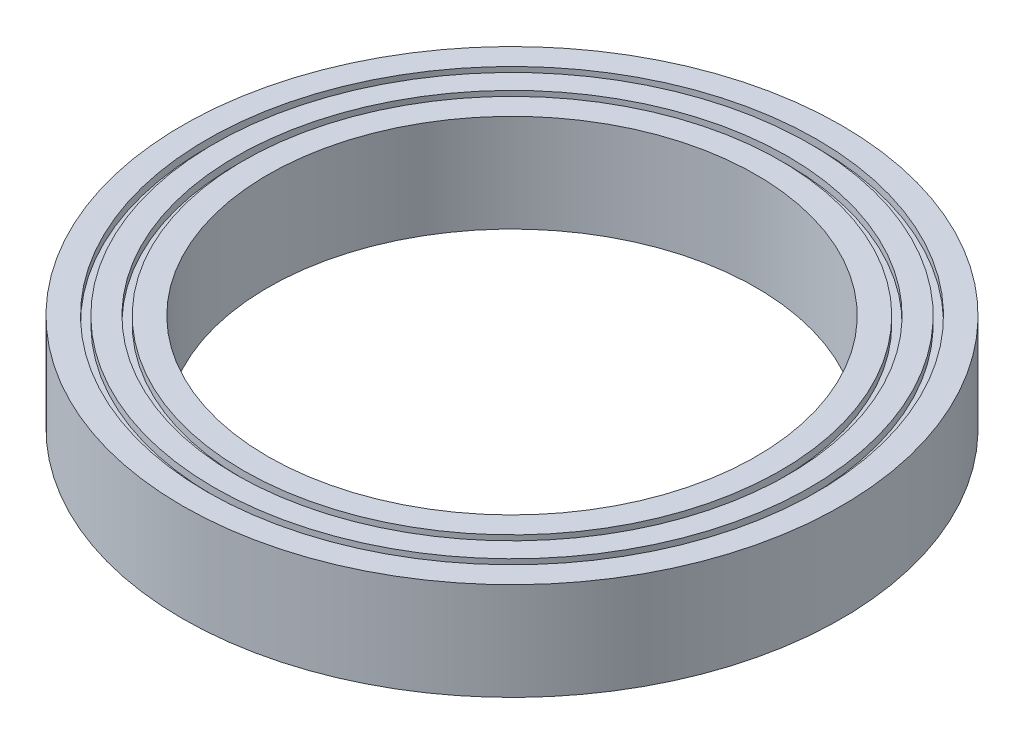
ISO-10303-21;
HEADER;
FILE_DESCRIPTION(('STEP AP214'),'2;1');
FILE_NAME('part.step','',(''),(''),'','','');
FILE_SCHEMA(('AUTOMOTIVE_DESIGN { 1 0 10303 214 1 1 1 1 }'));
ENDSEC;
DATA;
#1=APPLICATION_CONTEXT('core data for automotive mechanical design processes');
#2=APPLICATION_PROTOCOL_DEFINITION('international standard','automotive_design',2000,#1);
#3=PRODUCT_CONTEXT('',#1,'mechanical');
#4=PRODUCT('Part','Part','',(#3));
#5=PRODUCT_RELATED_PRODUCT_CATEGORY('part','',(#4));
#6=PRODUCT_DEFINITION_FORMATION('','',#4);
#7=PRODUCT_DEFINITION_CONTEXT('part definition',#1,'design');
#8=PRODUCT_DEFINITION('design','',#6,#7);
#9=PRODUCT_DEFINITION_SHAPE('','',#8);
#10=(LENGTH_UNIT() NAMED_UNIT(*) SI_UNIT(.MILLI.,.METRE.));
#11=(NAMED_UNIT(*) PLANE_ANGLE_UNIT() SI_UNIT($,.RADIAN.));
#12=(NAMED_UNIT(*) SI_UNIT($,.STERADIAN.) SOLID_ANGLE_UNIT());
#13=UNCERTAINTY_MEASURE_WITH_UNIT(LENGTH_MEASURE(1.E-05),#10,'distance_accuracy_value','');
#14=(GEOMETRIC_REPRESENTATION_CONTEXT(3) GLOBAL_UNCERTAINTY_ASSIGNED_CONTEXT((#13)) GLOBAL_UNIT_ASSIGNED_CONTEXT((#10,
#11,#12)) REPRESENTATION_CONTEXT('',''));
#15=CARTESIAN_POINT('',(0.,0.,0.));
#16=DIRECTION('',(0.,0.,1.));
#17=DIRECTION('',(1.,0.,0.));
#18=AXIS2_PLACEMENT_3D('',#15,#16,#17);
#19=CARTESIAN_POINT('',(0.,0.,0.));
#20=DIRECTION('',(0.,1.,0.));
#21=DIRECTION('',(0.,0.,1.));
#22=AXIS2_PLACEMENT_3D('',#19,#20,#21);
#23=PLANE('',#22);
#24=CARTESIAN_POINT('',(0.,0.,0.));
#25=DIRECTION('',(0.,1.,0.));
#26=DIRECTION('',(0.,0.,1.));
#27=AXIS2_PLACEMENT_3D('',#24,#25,#26);
#28=CIRCLE('',#27,10.);
#29=CARTESIAN_POINT('',(0.,0.,10.));
#30=VERTEX_POINT('',#29);
#31=EDGE_CURVE('E64',#30,#30,#28,.T.);
#32=ORIENTED_EDGE('',*,*,#31,.T.);
#33=EDGE_LOOP('',(#32));
#34=FACE_BOUND('',#33,.T.);
#35=CARTESIAN_POINT('',(0.,0.,0.));
#36=DIRECTION('',(0.,1.,0.));
#37=DIRECTION('',(0.,0.,1.));
#38=AXIS2_PLACEMENT_3D('',#35,#36,#37);
#39=CIRCLE('',#38,11.);
#40=CARTESIAN_POINT('',(0.,0.,11.));
#41=VERTEX_POINT('',#40);
#42=EDGE_CURVE('E109',#41,#41,#39,.T.);
#43=ORIENTED_EDGE('',*,*,#42,.F.);
#44=EDGE_LOOP('',(#43));
#45=FACE_BOUND('',#44,.T.);
#46=ADVANCED_FACE('F51',(#34,#45),#23,.F.);
#47=CARTESIAN_POINT('',(0.,0.,0.));
#48=DIRECTION('',(0.,1.,0.));
#49=DIRECTION('',(0.,0.,1.));
#50=AXIS2_PLACEMENT_3D('',#47,#48,#49);
#51=CIRCLE('',#50,11.3);
#52=CARTESIAN_POINT('',(0.,0.,11.3));
#53=VERTEX_POINT('',#52);
#54=EDGE_CURVE('E106',#53,#53,#51,.T.);
#55=ORIENTED_EDGE('',*,*,#54,.T.);
#56=EDGE_LOOP('',(#55));
#57=FACE_BOUND('',#56,.T.);
#58=CARTESIAN_POINT('',(0.,0.,0.));
#59=DIRECTION('',(0.,1.,0.));
#60=DIRECTION('',(0.,0.,1.));
#61=AXIS2_PLACEMENT_3D('',#58,#59,#60);
#62=CIRCLE('',#61,12.2);
#63=CARTESIAN_POINT('',(0.,0.,12.2));
#64=VERTEX_POINT('',#63);
#65=EDGE_CURVE('E98',#64,#64,#62,.T.);
#66=ORIENTED_EDGE('',*,*,#65,.F.);
#67=EDGE_LOOP('',(#66));
#68=FACE_BOUND('',#67,.T.);
#69=ADVANCED_FACE('F128',(#57,#68),#23,.F.);
#70=CARTESIAN_POINT('',(0.,4.,0.));
#71=DIRECTION('',(0.,1.,0.));
#72=DIRECTION('',(0.,0.,1.));
#73=AXIS2_PLACEMENT_3D('',#70,#71,#72);
#74=PLANE('',#73);
#75=CARTESIAN_POINT('',(0.,4.,0.));
#76=DIRECTION('',(0.,1.,0.));
#77=DIRECTION('',(0.,0.,1.));
#78=AXIS2_PLACEMENT_3D('',#75,#76,#77);
#79=CIRCLE('',#78,10.);
#80=CARTESIAN_POINT('',(0.,4.,10.));
#81=VERTEX_POINT('',#80);
#82=EDGE_CURVE('E65',#81,#81,#79,.T.);
#83=ORIENTED_EDGE('',*,*,#82,.F.);
#84=EDGE_LOOP('',(#83));
#85=FACE_BOUND('',#84,.T.);
#86=CARTESIAN_POINT('',(0.,4.,0.));
#87=DIRECTION('',(0.,1.,0.));
#88=DIRECTION('',(0.,0.,1.));
#89=AXIS2_PLACEMENT_3D('',#86,#87,#88);
#90=CIRCLE('',#89,11.);
#91=CARTESIAN_POINT('',(0.,4.,11.));
#92=VERTEX_POINT('',#91);
#93=EDGE_CURVE('E88',#92,#92,#90,.T.);
#94=ORIENTED_EDGE('',*,*,#93,.T.);
#95=EDGE_LOOP('',(#94));
#96=FACE_BOUND('',#95,.T.);
#97=ADVANCED_FACE('F140',(#85,#96),#74,.T.);
#98=CARTESIAN_POINT('',(0.,4.,0.));
#99=DIRECTION('',(0.,1.,0.));
#100=DIRECTION('',(0.,0.,1.));
#101=AXIS2_PLACEMENT_3D('',#98,#99,#100);
#102=CIRCLE('',#101,11.3);
#103=CARTESIAN_POINT('',(0.,4.,11.3));
#104=VERTEX_POINT('',#103);
#105=EDGE_CURVE('E81',#104,#104,#102,.T.);
#106=ORIENTED_EDGE('',*,*,#105,.F.);
#107=EDGE_LOOP('',(#106));
#108=FACE_BOUND('',#107,.T.);
#109=CARTESIAN_POINT('',(0.,4.,0.));
#110=DIRECTION('',(0.,1.,0.));
#111=DIRECTION('',(0.,0.,1.));
#112=AXIS2_PLACEMENT_3D('',#109,#110,#111);
#113=CIRCLE('',#112,12.2);
#114=CARTESIAN_POINT('',(0.,4.,12.2));
#115=VERTEX_POINT('',#114);
#116=EDGE_CURVE('E74',#115,#115,#113,.T.);
#117=ORIENTED_EDGE('',*,*,#116,.T.);
#118=EDGE_LOOP('',(#117));
#119=FACE_BOUND('',#118,.T.);
#120=ADVANCED_FACE('F147',(#108,#119),#74,.T.);
#121=CARTESIAN_POINT('',(0.,4.,0.));
#122=DIRECTION('',(0.,1.,0.));
#123=DIRECTION('',(0.,0.,1.));
#124=AXIS2_PLACEMENT_3D('',#121,#122,#123);
#125=CIRCLE('',#124,12.5);
#126=CARTESIAN_POINT('',(0.,4.,12.5));
#127=VERTEX_POINT('',#126);
#128=EDGE_CURVE('E68',#127,#127,#125,.T.);
#129=ORIENTED_EDGE('',*,*,#128,.F.);
#130=EDGE_LOOP('',(#129));
#131=FACE_BOUND('',#130,.T.);
#132=CARTESIAN_POINT('',(0.,4.,0.));
#133=DIRECTION('',(0.,1.,0.));
#134=DIRECTION('',(0.,0.,1.));
#135=AXIS2_PLACEMENT_3D('',#132,#133,#134);
#136=CIRCLE('',#135,13.5);
#137=CARTESIAN_POINT('',(0.,4.,13.5));
#138=VERTEX_POINT('',#137);
#139=EDGE_CURVE('E11',#138,#138,#136,.T.);
#140=ORIENTED_EDGE('',*,*,#139,.T.);
#141=EDGE_LOOP('',(#140));
#142=FACE_BOUND('',#141,.T.);
#143=ADVANCED_FACE('F142',(#131,#142),#74,.T.);
#144=CARTESIAN_POINT('',(0.,0.,0.));
#145=DIRECTION('',(0.,1.,0.));
#146=DIRECTION('',(0.,0.,1.));
#147=AXIS2_PLACEMENT_3D('',#144,#145,#146);
#148=CIRCLE('',#147,12.5);
#149=CARTESIAN_POINT('',(0.,0.,12.5));
#150=VERTEX_POINT('',#149);
#151=EDGE_CURVE('E94',#150,#150,#148,.T.);
#152=ORIENTED_EDGE('',*,*,#151,.T.);
#153=EDGE_LOOP('',(#152));
#154=FACE_BOUND('',#153,.T.);
#155=CARTESIAN_POINT('',(0.,0.,0.));
#156=DIRECTION('',(0.,1.,0.));
#157=DIRECTION('',(0.,0.,1.));
#158=AXIS2_PLACEMENT_3D('',#155,#156,#157);
#159=CIRCLE('',#158,13.5);
#160=CARTESIAN_POINT('',(0.,0.,13.5));
#161=VERTEX_POINT('',#160);
#162=EDGE_CURVE('E54',#161,#161,#159,.T.);
#163=ORIENTED_EDGE('',*,*,#162,.F.);
#164=EDGE_LOOP('',(#163));
#165=FACE_BOUND('',#164,.T.);
#166=ADVANCED_FACE('F135',(#154,#165),#23,.F.);
#167=CARTESIAN_POINT('',(0.,4.,0.));
#168=DIRECTION('',(0.,-1.,0.));
#169=DIRECTION('',(0.,0.,-1.));
#170=AXIS2_PLACEMENT_3D('',#167,#168,#169);
#171=CYLINDRICAL_SURFACE('',#170,13.5);
#172=ORIENTED_EDGE('',*,*,#139,.F.);
#173=EDGE_LOOP('',(#172));
#174=FACE_BOUND('',#173,.T.);
#175=ORIENTED_EDGE('',*,*,#162,.T.);
#176=EDGE_LOOP('',(#175));
#177=FACE_BOUND('',#176,.T.);
#178=ADVANCED_FACE('F52',(#174,#177),#171,.T.);
#179=CARTESIAN_POINT('',(0.,4.,0.));
#180=DIRECTION('',(0.,-1.,0.));
#181=DIRECTION('',(0.,0.,-1.));
#182=AXIS2_PLACEMENT_3D('',#179,#180,#181);
#183=CYLINDRICAL_SURFACE('',#182,10.);
#184=ORIENTED_EDGE('',*,*,#82,.T.);
#185=EDGE_LOOP('',(#184));
#186=FACE_BOUND('',#185,.T.);
#187=ORIENTED_EDGE('',*,*,#31,.F.);
#188=EDGE_LOOP('',(#187));
#189=FACE_BOUND('',#188,.T.);
#190=ADVANCED_FACE('F150',(#186,#189),#183,.F.);
#191=CARTESIAN_POINT('',(0.,3.7,0.));
#192=DIRECTION('',(0.,1.,0.));
#193=DIRECTION('',(0.,0.,1.));
#194=AXIS2_PLACEMENT_3D('',#191,#192,#193);
#195=CYLINDRICAL_SURFACE('',#194,12.2);
#196=CARTESIAN_POINT('',(0.,3.7,0.));
#197=DIRECTION('',(0.,1.,0.));
#198=DIRECTION('',(0.,0.,1.));
#199=AXIS2_PLACEMENT_3D('',#196,#197,#198);
#200=CIRCLE('',#199,12.2);
#201=CARTESIAN_POINT('',(0.,3.7,12.2));
#202=VERTEX_POINT('',#201);
#203=EDGE_CURVE('E71',#202,#202,#200,.T.);
#204=ORIENTED_EDGE('',*,*,#203,.T.);
#205=EDGE_LOOP('',(#204));
#206=FACE_BOUND('',#205,.T.);
#207=ORIENTED_EDGE('',*,*,#116,.F.);
#208=EDGE_LOOP('',(#207));
#209=FACE_BOUND('',#208,.T.);
#210=ADVANCED_FACE('F187',(#206,#209),#195,.T.);
#211=CARTESIAN_POINT('',(0.,3.7,0.));
#212=DIRECTION('',(0.,1.,0.));
#213=DIRECTION('',(0.,0.,1.));
#214=AXIS2_PLACEMENT_3D('',#211,#212,#213);
#215=CYLINDRICAL_SURFACE('',#214,12.5);
#216=CARTESIAN_POINT('',(0.,3.7,0.));
#217=DIRECTION('',(0.,1.,0.));
#218=DIRECTION('',(0.,0.,1.));
#219=AXIS2_PLACEMENT_3D('',#216,#217,#218);
#220=CIRCLE('',#219,12.5);
#221=CARTESIAN_POINT('',(0.,3.7,12.5));
#222=VERTEX_POINT('',#221);
#223=EDGE_CURVE('E70',#222,#222,#220,.T.);
#224=ORIENTED_EDGE('',*,*,#223,.F.);
#225=EDGE_LOOP('',(#224));
#226=FACE_BOUND('',#225,.T.);
#227=ORIENTED_EDGE('',*,*,#128,.T.);
#228=EDGE_LOOP('',(#227));
#229=FACE_BOUND('',#228,.T.);
#230=ADVANCED_FACE('F183',(#226,#229),#215,.F.);
#231=CARTESIAN_POINT('',(0.,3.7,0.));
#232=DIRECTION('',(0.,1.,0.));
#233=DIRECTION('',(0.,0.,1.));
#234=AXIS2_PLACEMENT_3D('',#231,#232,#233);
#235=PLANE('',#234);
#236=ORIENTED_EDGE('',*,*,#203,.F.);
#237=EDGE_LOOP('',(#236));
#238=FACE_BOUND('',#237,.T.);
#239=ORIENTED_EDGE('',*,*,#223,.T.);
#240=EDGE_LOOP('',(#239));
#241=FACE_BOUND('',#240,.T.);
#242=ADVANCED_FACE('F182',(#238,#241),#235,.T.);
#243=CARTESIAN_POINT('',(0.,3.7,0.));
#244=DIRECTION('',(0.,1.,0.));
#245=DIRECTION('',(0.,0.,1.));
#246=AXIS2_PLACEMENT_3D('',#243,#244,#245);
#247=CYLINDRICAL_SURFACE('',#246,11.);
#248=CARTESIAN_POINT('',(0.,3.7,0.));
#249=DIRECTION('',(0.,1.,0.));
#250=DIRECTION('',(0.,0.,1.));
#251=AXIS2_PLACEMENT_3D('',#248,#249,#250);
#252=CIRCLE('',#251,11.);
#253=CARTESIAN_POINT('',(0.,3.7,11.));
#254=VERTEX_POINT('',#253);
#255=EDGE_CURVE('E82',#254,#254,#252,.T.);
#256=ORIENTED_EDGE('',*,*,#255,.T.);
#257=EDGE_LOOP('',(#256));
#258=FACE_BOUND('',#257,.T.);
#259=ORIENTED_EDGE('',*,*,#93,.F.);
#260=EDGE_LOOP('',(#259));
#261=FACE_BOUND('',#260,.T.);
#262=ADVANCED_FACE('F180',(#258,#261),#247,.T.);
#263=CARTESIAN_POINT('',(0.,3.7,0.));
#264=DIRECTION('',(0.,1.,0.));
#265=DIRECTION('',(0.,0.,1.));
#266=AXIS2_PLACEMENT_3D('',#263,#264,#265);
#267=CYLINDRICAL_SURFACE('',#266,11.3);
#268=CARTESIAN_POINT('',(0.,3.7,0.));
#269=DIRECTION('',(0.,1.,0.));
#270=DIRECTION('',(0.,0.,1.));
#271=AXIS2_PLACEMENT_3D('',#268,#269,#270);
#272=CIRCLE('',#271,11.3);
#273=CARTESIAN_POINT('',(0.,3.7,11.3));
#274=VERTEX_POINT('',#273);
#275=EDGE_CURVE('E80',#274,#274,#272,.T.);
#276=ORIENTED_EDGE('',*,*,#275,.F.);
#277=EDGE_LOOP('',(#276));
#278=FACE_BOUND('',#277,.T.);
#279=ORIENTED_EDGE('',*,*,#105,.T.);
#280=EDGE_LOOP('',(#279));
#281=FACE_BOUND('',#280,.T.);
#282=ADVANCED_FACE('F173',(#278,#281),#267,.F.);
#283=CARTESIAN_POINT('',(0.,3.7,0.));
#284=DIRECTION('',(0.,1.,0.));
#285=DIRECTION('',(0.,0.,1.));
#286=AXIS2_PLACEMENT_3D('',#283,#284,#285);
#287=PLANE('',#286);
#288=ORIENTED_EDGE('',*,*,#255,.F.);
#289=EDGE_LOOP('',(#288));
#290=FACE_BOUND('',#289,.T.);
#291=ORIENTED_EDGE('',*,*,#275,.T.);
#292=EDGE_LOOP('',(#291));
#293=FACE_BOUND('',#292,.T.);
#294=ADVANCED_FACE('F169',(#290,#293),#287,.T.);
#295=CARTESIAN_POINT('',(0.,0.3,0.));
#296=DIRECTION('',(0.,-1.,0.));
#297=DIRECTION('',(0.,0.,-1.));
#298=AXIS2_PLACEMENT_3D('',#295,#296,#297);
#299=CYLINDRICAL_SURFACE('',#298,12.2);
#300=CARTESIAN_POINT('',(0.,0.3,0.));
#301=DIRECTION('',(0.,1.,0.));
#302=DIRECTION('',(0.,0.,1.));
#303=AXIS2_PLACEMENT_3D('',#300,#301,#302);
#304=CIRCLE('',#303,12.2);
#305=CARTESIAN_POINT('',(0.,0.3,12.2));
#306=VERTEX_POINT('',#305);
#307=EDGE_CURVE('E100',#306,#306,#304,.T.);
#308=ORIENTED_EDGE('',*,*,#307,.F.);
#309=EDGE_LOOP('',(#308));
#310=FACE_BOUND('',#309,.T.);
#311=ORIENTED_EDGE('',*,*,#65,.T.);
#312=EDGE_LOOP('',(#311));
#313=FACE_BOUND('',#312,.T.);
#314=ADVANCED_FACE('F157',(#310,#313),#299,.T.);
#315=CARTESIAN_POINT('',(0.,0.3,0.));
#316=DIRECTION('',(0.,-1.,0.));
#317=DIRECTION('',(0.,0.,-1.));
#318=AXIS2_PLACEMENT_3D('',#315,#316,#317);
#319=CYLINDRICAL_SURFACE('',#318,12.5);
#320=CARTESIAN_POINT('',(0.,0.3,0.));
#321=DIRECTION('',(0.,1.,0.));
#322=DIRECTION('',(0.,0.,1.));
#323=AXIS2_PLACEMENT_3D('',#320,#321,#322);
#324=CIRCLE('',#323,12.5);
#325=CARTESIAN_POINT('',(0.,0.3,12.5));
#326=VERTEX_POINT('',#325);
#327=EDGE_CURVE('E90',#326,#326,#324,.T.);
#328=ORIENTED_EDGE('',*,*,#327,.T.);
#329=EDGE_LOOP('',(#328));
#330=FACE_BOUND('',#329,.T.);
#331=ORIENTED_EDGE('',*,*,#151,.F.);
#332=EDGE_LOOP('',(#331));
#333=FACE_BOUND('',#332,.T.);
#334=ADVANCED_FACE('F160',(#330,#333),#319,.F.);
#335=CARTESIAN_POINT('',(0.,0.3,0.));
#336=DIRECTION('',(0.,-1.,0.));
#337=DIRECTION('',(0.,0.,1.));
#338=AXIS2_PLACEMENT_3D('',#335,#336,#337);
#339=PLANE('',#338);
#340=ORIENTED_EDGE('',*,*,#307,.T.);
#341=EDGE_LOOP('',(#340));
#342=FACE_BOUND('',#341,.T.);
#343=ORIENTED_EDGE('',*,*,#327,.F.);
#344=EDGE_LOOP('',(#343));
#345=FACE_BOUND('',#344,.T.);
#346=ADVANCED_FACE('F123',(#342,#345),#339,.T.);
#347=CARTESIAN_POINT('',(0.,0.3,0.));
#348=DIRECTION('',(0.,-1.,0.));
#349=DIRECTION('',(0.,0.,-1.));
#350=AXIS2_PLACEMENT_3D('',#347,#348,#349);
#351=CYLINDRICAL_SURFACE('',#350,11.);
#352=CARTESIAN_POINT('',(0.,0.3,0.));
#353=DIRECTION('',(0.,1.,0.));
#354=DIRECTION('',(0.,0.,1.));
#355=AXIS2_PLACEMENT_3D('',#352,#353,#354);
#356=CIRCLE('',#355,11.);
#357=CARTESIAN_POINT('',(0.,0.3,11.));
#358=VERTEX_POINT('',#357);
#359=EDGE_CURVE('E108',#358,#358,#356,.T.);
#360=ORIENTED_EDGE('',*,*,#359,.F.);
#361=EDGE_LOOP('',(#360));
#362=FACE_BOUND('',#361,.T.);
#363=ORIENTED_EDGE('',*,*,#42,.T.);
#364=EDGE_LOOP('',(#363));
#365=FACE_BOUND('',#364,.T.);
#366=ADVANCED_FACE('F122',(#362,#365),#351,.T.);
#367=CARTESIAN_POINT('',(0.,0.3,0.));
#368=DIRECTION('',(0.,-1.,0.));
#369=DIRECTION('',(0.,0.,-1.));
#370=AXIS2_PLACEMENT_3D('',#367,#368,#369);
#371=CYLINDRICAL_SURFACE('',#370,11.3);
#372=CARTESIAN_POINT('',(0.,0.3,0.));
#373=DIRECTION('',(0.,1.,0.));
#374=DIRECTION('',(0.,0.,1.));
#375=AXIS2_PLACEMENT_3D('',#372,#373,#374);
#376=CIRCLE('',#375,11.3);
#377=CARTESIAN_POINT('',(0.,0.3,11.3));
#378=VERTEX_POINT('',#377);
#379=EDGE_CURVE('E101',#378,#378,#376,.T.);
#380=ORIENTED_EDGE('',*,*,#379,.T.);
#381=EDGE_LOOP('',(#380));
#382=FACE_BOUND('',#381,.T.);
#383=ORIENTED_EDGE('',*,*,#54,.F.);
#384=EDGE_LOOP('',(#383));
#385=FACE_BOUND('',#384,.T.);
#386=ADVANCED_FACE('F121',(#382,#385),#371,.F.);
#387=CARTESIAN_POINT('',(0.,0.3,0.));
#388=DIRECTION('',(0.,-1.,0.));
#389=DIRECTION('',(0.,0.,1.));
#390=AXIS2_PLACEMENT_3D('',#387,#388,#389);
#391=PLANE('',#390);
#392=ORIENTED_EDGE('',*,*,#359,.T.);
#393=EDGE_LOOP('',(#392));
#394=FACE_BOUND('',#393,.T.);
#395=ORIENTED_EDGE('',*,*,#379,.F.);
#396=EDGE_LOOP('',(#395));
#397=FACE_BOUND('',#396,.T.);
#398=ADVANCED_FACE('F118',(#394,#397),#391,.T.);
#399=CLOSED_SHELL('',(#46,#69,#97,#120,#143,#166,#178,#190,#210,#230,#242,#262,#282,#294,#314,
#334,#346,#366,#386,#398));
#400=MANIFOLD_SOLID_BREP('B2',#399);
#401=ADVANCED_BREP_SHAPE_REPRESENTATION('',(#18,#400),#14);
#402=SHAPE_DEFINITION_REPRESENTATION(#9,#401);
ENDSEC;
END-ISO-10303-21;
